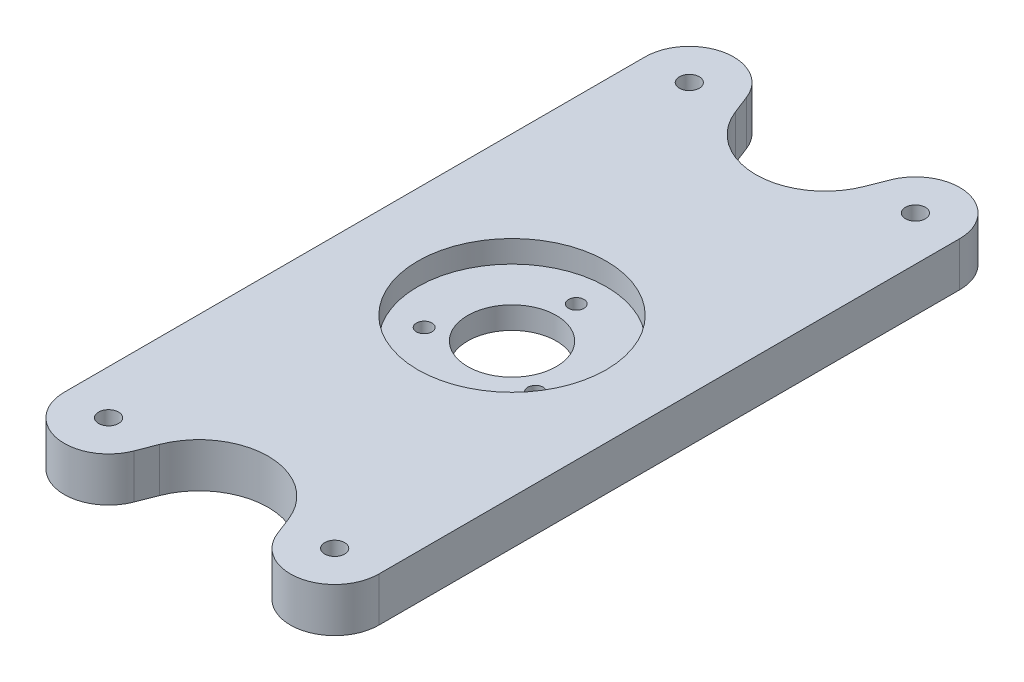
ISO-10303-21;
HEADER;
FILE_DESCRIPTION(('STEP AP214'),'2;1');
FILE_NAME('part.step','',(''),(''),'','','');
FILE_SCHEMA(('AUTOMOTIVE_DESIGN { 1 0 10303 214 1 1 1 1 }'));
ENDSEC;
DATA;
#1=APPLICATION_CONTEXT('core data for automotive mechanical design processes');
#2=APPLICATION_PROTOCOL_DEFINITION('international standard','automotive_design',2000,#1);
#3=PRODUCT_CONTEXT('',#1,'mechanical');
#4=PRODUCT('Part','Part','',(#3));
#5=PRODUCT_RELATED_PRODUCT_CATEGORY('part','',(#4));
#6=PRODUCT_DEFINITION_FORMATION('','',#4);
#7=PRODUCT_DEFINITION_CONTEXT('part definition',#1,'design');
#8=PRODUCT_DEFINITION('design','',#6,#7);
#9=PRODUCT_DEFINITION_SHAPE('','',#8);
#10=(LENGTH_UNIT() NAMED_UNIT(*) SI_UNIT(.MILLI.,.METRE.));
#11=(NAMED_UNIT(*) PLANE_ANGLE_UNIT() SI_UNIT($,.RADIAN.));
#12=(NAMED_UNIT(*) SI_UNIT($,.STERADIAN.) SOLID_ANGLE_UNIT());
#13=UNCERTAINTY_MEASURE_WITH_UNIT(LENGTH_MEASURE(1.E-05),#10,'distance_accuracy_value','');
#14=(GEOMETRIC_REPRESENTATION_CONTEXT(3) GLOBAL_UNCERTAINTY_ASSIGNED_CONTEXT((#13)) GLOBAL_UNIT_ASSIGNED_CONTEXT((#10,
#11,#12)) REPRESENTATION_CONTEXT('',''));
#15=CARTESIAN_POINT('',(0.,0.,0.));
#16=DIRECTION('',(0.,0.,1.));
#17=DIRECTION('',(1.,0.,0.));
#18=AXIS2_PLACEMENT_3D('',#15,#16,#17);
#19=CARTESIAN_POINT('',(9.3187111062915,10.,3.62789516351805));
#20=DIRECTION('',(0.931871110629158,0.,0.362789516351808));
#21=DIRECTION('',(0.362789516351808,0.,-0.931871110629158));
#22=AXIS2_PLACEMENT_3D('',#19,#20,#21);
#23=PLANE('',#22);
#24=DIRECTION('',(-0.362789516351808,0.,0.931871110629158));
#25=VECTOR('',#24,1.);
#26=CARTESIAN_POINT('',(9.3187111062915,0.,3.62789516351805));
#27=LINE('',#26,#25);
#28=CARTESIAN_POINT('',(-14.5561128633833,0.,64.9534233993496));
#29=VERTEX_POINT('',#28);
#30=CARTESIAN_POINT('',(-16.1812888937084,0.,69.1278951635181));
#31=VERTEX_POINT('',#30);
#32=EDGE_CURVE('E185',#29,#31,#27,.T.);
#33=ORIENTED_EDGE('',*,*,#32,.F.);
#34=DIRECTION('',(0.,-1.,0.));
#35=VECTOR('',#34,1.);
#36=CARTESIAN_POINT('',(-14.5561128633833,10.,64.9534233993496));
#37=LINE('',#36,#35);
#38=CARTESIAN_POINT('',(-14.5561128633833,10.,64.9534233993496));
#39=VERTEX_POINT('',#38);
#40=EDGE_CURVE('E11',#39,#29,#37,.T.);
#41=ORIENTED_EDGE('',*,*,#40,.F.);
#42=DIRECTION('',(-0.362789516351808,0.,0.931871110629158));
#43=VECTOR('',#42,1.);
#44=CARTESIAN_POINT('',(9.3187111062915,10.,3.62789516351805));
#45=LINE('',#44,#43);
#46=CARTESIAN_POINT('',(-16.1812888937084,10.,69.1278951635181));
#47=VERTEX_POINT('',#46);
#48=EDGE_CURVE('E358',#39,#47,#45,.T.);
#49=ORIENTED_EDGE('',*,*,#48,.T.);
#50=DIRECTION('',(0.,-1.,0.));
#51=VECTOR('',#50,1.);
#52=CARTESIAN_POINT('',(-16.1812888937084,10.,69.1278951635181));
#53=LINE('',#52,#51);
#54=EDGE_CURVE('E98',#47,#31,#53,.T.);
#55=ORIENTED_EDGE('',*,*,#54,.T.);
#56=EDGE_LOOP('',(#33,#41,#49,#55));
#57=FACE_BOUND('',#56,.T.);
#58=ADVANCED_FACE('F35',(#57),#23,.T.);
#59=CARTESIAN_POINT('',(0.,10.,70.6203070331858));
#60=DIRECTION('',(0.,-1.,0.));
#61=DIRECTION('',(0.,0.,-1.));
#62=AXIS2_PLACEMENT_3D('',#59,#60,#61);
#63=CYLINDRICAL_SURFACE('',#62,15.6203070331863);
#64=CARTESIAN_POINT('',(0.,0.,70.6203070331858));
#65=DIRECTION('',(0.,1.,0.));
#66=DIRECTION('',(0.,0.,1.));
#67=AXIS2_PLACEMENT_3D('',#64,#65,#66);
#68=CIRCLE('',#67,15.6203070331863);
#69=CARTESIAN_POINT('',(14.5561128633841,0.,64.9534233993491));
#70=VERTEX_POINT('',#69);
#71=EDGE_CURVE('E183',#29,#70,#68,.F.);
#72=ORIENTED_EDGE('',*,*,#71,.T.);
#73=DIRECTION('',(0.,-1.,0.));
#74=VECTOR('',#73,1.);
#75=CARTESIAN_POINT('',(14.5561128633841,10.,64.9534233993491));
#76=LINE('',#75,#74);
#77=CARTESIAN_POINT('',(14.5561128633841,10.,64.9534233993491));
#78=VERTEX_POINT('',#77);
#79=EDGE_CURVE('E44',#78,#70,#76,.T.);
#80=ORIENTED_EDGE('',*,*,#79,.F.);
#81=CARTESIAN_POINT('',(0.,10.,70.6203070331858));
#82=DIRECTION('',(0.,1.,0.));
#83=DIRECTION('',(0.,0.,1.));
#84=AXIS2_PLACEMENT_3D('',#81,#82,#83);
#85=CIRCLE('',#84,15.6203070331863);
#86=EDGE_CURVE('E360',#39,#78,#85,.F.);
#87=ORIENTED_EDGE('',*,*,#86,.F.);
#88=ORIENTED_EDGE('',*,*,#40,.T.);
#89=EDGE_LOOP('',(#72,#80,#87,#88));
#90=FACE_BOUND('',#89,.T.);
#91=ADVANCED_FACE('F184',(#90),#63,.F.);
#92=CARTESIAN_POINT('',(-9.31871110627818,10.,3.62789516351056));
#93=DIRECTION('',(0.931871110629236,0.,-0.362789516351608));
#94=DIRECTION('',(-0.362789516351608,0.,-0.931871110629236));
#95=AXIS2_PLACEMENT_3D('',#92,#93,#94);
#96=PLANE('',#95);
#97=DIRECTION('',(0.362789516351608,0.,0.931871110629236));
#98=VECTOR('',#97,1.);
#99=CARTESIAN_POINT('',(-9.31871110627818,0.,3.62789516351056));
#100=LINE('',#99,#98);
#101=CARTESIAN_POINT('',(16.1812888937084,0.,69.1278951635181));
#102=VERTEX_POINT('',#101);
#103=EDGE_CURVE('E177',#70,#102,#100,.T.);
#104=ORIENTED_EDGE('',*,*,#103,.T.);
#105=DIRECTION('',(0.,-1.,0.));
#106=VECTOR('',#105,1.);
#107=CARTESIAN_POINT('',(16.1812888937084,10.,69.1278951635181));
#108=LINE('',#107,#106);
#109=CARTESIAN_POINT('',(16.1812888937084,10.,69.1278951635181));
#110=VERTEX_POINT('',#109);
#111=EDGE_CURVE('E168',#110,#102,#108,.T.);
#112=ORIENTED_EDGE('',*,*,#111,.F.);
#113=DIRECTION('',(0.362789516351608,0.,0.931871110629236));
#114=VECTOR('',#113,1.);
#115=CARTESIAN_POINT('',(-9.31871110627818,10.,3.62789516351056));
#116=LINE('',#115,#114);
#117=EDGE_CURVE('E179',#78,#110,#116,.T.);
#118=ORIENTED_EDGE('',*,*,#117,.F.);
#119=ORIENTED_EDGE('',*,*,#79,.T.);
#120=EDGE_LOOP('',(#104,#112,#118,#119));
#121=FACE_BOUND('',#120,.T.);
#122=ADVANCED_FACE('F175',(#121),#96,.F.);
#123=CARTESIAN_POINT('',(25.5,10.,65.5));
#124=DIRECTION('',(0.,-1.,0.));
#125=DIRECTION('',(0.,0.,-1.));
#126=AXIS2_PLACEMENT_3D('',#123,#124,#125);
#127=CYLINDRICAL_SURFACE('',#126,9.99999999999997);
#128=CARTESIAN_POINT('',(25.5,0.,65.5));
#129=DIRECTION('',(0.,1.,0.));
#130=DIRECTION('',(0.,0.,1.));
#131=AXIS2_PLACEMENT_3D('',#128,#129,#130);
#132=CIRCLE('',#131,9.99999999999997);
#133=CARTESIAN_POINT('',(35.5,0.,65.5));
#134=VERTEX_POINT('',#133);
#135=EDGE_CURVE('E187',#102,#134,#132,.T.);
#136=ORIENTED_EDGE('',*,*,#135,.T.);
#137=DIRECTION('',(0.,-1.,0.));
#138=VECTOR('',#137,1.);
#139=CARTESIAN_POINT('',(35.5,10.,65.5));
#140=LINE('',#139,#138);
#141=CARTESIAN_POINT('',(35.5,10.,65.5));
#142=VERTEX_POINT('',#141);
#143=EDGE_CURVE('E166',#142,#134,#140,.T.);
#144=ORIENTED_EDGE('',*,*,#143,.F.);
#145=CARTESIAN_POINT('',(25.5,10.,65.5));
#146=DIRECTION('',(0.,1.,0.));
#147=DIRECTION('',(0.,0.,1.));
#148=AXIS2_PLACEMENT_3D('',#145,#146,#147);
#149=CIRCLE('',#148,9.99999999999997);
#150=EDGE_CURVE('E363',#110,#142,#149,.T.);
#151=ORIENTED_EDGE('',*,*,#150,.F.);
#152=ORIENTED_EDGE('',*,*,#111,.T.);
#153=EDGE_LOOP('',(#136,#144,#151,#152));
#154=FACE_BOUND('',#153,.T.);
#155=ADVANCED_FACE('F253',(#154),#127,.T.);
#156=CARTESIAN_POINT('',(35.4999999999997,10.,-1.72995629695884E-13));
#157=DIRECTION('',(1.,0.,0.));
#158=DIRECTION('',(0.,0.,-1.));
#159=AXIS2_PLACEMENT_3D('',#156,#157,#158);
#160=PLANE('',#159);
#161=DIRECTION('',(0.,0.,1.));
#162=VECTOR('',#161,1.);
#163=CARTESIAN_POINT('',(35.4999999999997,0.,-1.72995629695884E-13));
#164=LINE('',#163,#162);
#165=CARTESIAN_POINT('',(35.4999999999993,0.,-65.5));
#166=VERTEX_POINT('',#165);
#167=EDGE_CURVE('E195',#166,#134,#164,.T.);
#168=ORIENTED_EDGE('',*,*,#167,.F.);
#169=DIRECTION('',(0.,-1.,0.));
#170=VECTOR('',#169,1.);
#171=CARTESIAN_POINT('',(35.4999999999993,10.,-65.5));
#172=LINE('',#171,#170);
#173=CARTESIAN_POINT('',(35.4999999999993,10.,-65.5));
#174=VERTEX_POINT('',#173);
#175=EDGE_CURVE('E164',#174,#166,#172,.T.);
#176=ORIENTED_EDGE('',*,*,#175,.F.);
#177=DIRECTION('',(0.,0.,1.));
#178=VECTOR('',#177,1.);
#179=CARTESIAN_POINT('',(35.4999999999997,10.,-1.72995629695884E-13));
#180=LINE('',#179,#178);
#181=EDGE_CURVE('E365',#174,#142,#180,.T.);
#182=ORIENTED_EDGE('',*,*,#181,.T.);
#183=ORIENTED_EDGE('',*,*,#143,.T.);
#184=EDGE_LOOP('',(#168,#176,#182,#183));
#185=FACE_BOUND('',#184,.T.);
#186=ADVANCED_FACE('F256',(#185),#160,.T.);
#187=CARTESIAN_POINT('',(25.5,10.,-65.5));
#188=DIRECTION('',(0.,-1.,0.));
#189=DIRECTION('',(0.,0.,-1.));
#190=AXIS2_PLACEMENT_3D('',#187,#188,#189);
#191=CYLINDRICAL_SURFACE('',#190,9.99999999999966);
#192=CARTESIAN_POINT('',(25.5,0.,-65.5));
#193=DIRECTION('',(0.,1.,0.));
#194=DIRECTION('',(0.,0.,1.));
#195=AXIS2_PLACEMENT_3D('',#192,#193,#194);
#196=CIRCLE('',#195,9.99999999999966);
#197=CARTESIAN_POINT('',(16.1812888937084,0.,-69.1278951635181));
#198=VERTEX_POINT('',#197);
#199=EDGE_CURVE('E198',#166,#198,#196,.T.);
#200=ORIENTED_EDGE('',*,*,#199,.T.);
#201=DIRECTION('',(0.,-1.,0.));
#202=VECTOR('',#201,1.);
#203=CARTESIAN_POINT('',(16.1812888937084,10.,-69.1278951635181));
#204=LINE('',#203,#202);
#205=CARTESIAN_POINT('',(16.1812888937084,10.,-69.1278951635181));
#206=VERTEX_POINT('',#205);
#207=EDGE_CURVE('E161',#206,#198,#204,.T.);
#208=ORIENTED_EDGE('',*,*,#207,.F.);
#209=CARTESIAN_POINT('',(25.5,10.,-65.5));
#210=DIRECTION('',(0.,1.,0.));
#211=DIRECTION('',(0.,0.,1.));
#212=AXIS2_PLACEMENT_3D('',#209,#210,#211);
#213=CIRCLE('',#212,9.99999999999966);
#214=EDGE_CURVE('E368',#174,#206,#213,.T.);
#215=ORIENTED_EDGE('',*,*,#214,.F.);
#216=ORIENTED_EDGE('',*,*,#175,.T.);
#217=EDGE_LOOP('',(#200,#208,#215,#216));
#218=FACE_BOUND('',#217,.T.);
#219=ADVANCED_FACE('F260',(#218),#191,.T.);
#220=CARTESIAN_POINT('',(-9.31871110628636,10.,-3.62789516351516));
#221=DIRECTION('',(0.931871110629188,0.,0.362789516351731));
#222=DIRECTION('',(0.362789516351731,0.,-0.931871110629188));
#223=AXIS2_PLACEMENT_3D('',#220,#221,#222);
#224=PLANE('',#223);
#225=DIRECTION('',(-0.362789516351731,0.,0.931871110629188));
#226=VECTOR('',#225,1.);
#227=CARTESIAN_POINT('',(-9.31871110628636,0.,-3.62789516351516));
#228=LINE('',#227,#226);
#229=CARTESIAN_POINT('',(14.5561128633836,0.,-64.9534233993494));
#230=VERTEX_POINT('',#229);
#231=EDGE_CURVE('E201',#198,#230,#228,.T.);
#232=ORIENTED_EDGE('',*,*,#231,.T.);
#233=DIRECTION('',(0.,-1.,0.));
#234=VECTOR('',#233,1.);
#235=CARTESIAN_POINT('',(14.5561128633836,10.,-64.9534233993494));
#236=LINE('',#235,#234);
#237=CARTESIAN_POINT('',(14.5561128633836,10.,-64.9534233993494));
#238=VERTEX_POINT('',#237);
#239=EDGE_CURVE('E159',#238,#230,#236,.T.);
#240=ORIENTED_EDGE('',*,*,#239,.F.);
#241=DIRECTION('',(-0.362789516351731,0.,0.931871110629188));
#242=VECTOR('',#241,1.);
#243=CARTESIAN_POINT('',(-9.31871110628636,10.,-3.62789516351516));
#244=LINE('',#243,#242);
#245=EDGE_CURVE('E371',#206,#238,#244,.T.);
#246=ORIENTED_EDGE('',*,*,#245,.F.);
#247=ORIENTED_EDGE('',*,*,#207,.T.);
#248=EDGE_LOOP('',(#232,#240,#246,#247));
#249=FACE_BOUND('',#248,.T.);
#250=ADVANCED_FACE('F264',(#249),#224,.F.);
#251=CARTESIAN_POINT('',(0.,10.,-70.6203070331858));
#252=DIRECTION('',(0.,-1.,0.));
#253=DIRECTION('',(0.,0.,-1.));
#254=AXIS2_PLACEMENT_3D('',#251,#252,#253);
#255=CYLINDRICAL_SURFACE('',#254,15.620307033186);
#256=CARTESIAN_POINT('',(0.,0.,-70.6203070331858));
#257=DIRECTION('',(0.,1.,0.));
#258=DIRECTION('',(0.,0.,1.));
#259=AXIS2_PLACEMENT_3D('',#256,#257,#258);
#260=CIRCLE('',#259,15.620307033186);
#261=CARTESIAN_POINT('',(-14.5561128633833,0.,-64.9534233993495));
#262=VERTEX_POINT('',#261);
#263=EDGE_CURVE('E204',#262,#230,#260,.T.);
#264=ORIENTED_EDGE('',*,*,#263,.F.);
#265=DIRECTION('',(0.,-1.,0.));
#266=VECTOR('',#265,1.);
#267=CARTESIAN_POINT('',(-14.5561128633833,10.,-64.9534233993495));
#268=LINE('',#267,#266);
#269=CARTESIAN_POINT('',(-14.5561128633833,10.,-64.9534233993495));
#270=VERTEX_POINT('',#269);
#271=EDGE_CURVE('E153',#270,#262,#268,.T.);
#272=ORIENTED_EDGE('',*,*,#271,.F.);
#273=CARTESIAN_POINT('',(0.,10.,-70.6203070331858));
#274=DIRECTION('',(0.,1.,0.));
#275=DIRECTION('',(0.,0.,1.));
#276=AXIS2_PLACEMENT_3D('',#273,#274,#275);
#277=CIRCLE('',#276,15.620307033186);
#278=EDGE_CURVE('E373',#270,#238,#277,.T.);
#279=ORIENTED_EDGE('',*,*,#278,.T.);
#280=ORIENTED_EDGE('',*,*,#239,.T.);
#281=EDGE_LOOP('',(#264,#272,#279,#280));
#282=FACE_BOUND('',#281,.T.);
#283=ADVANCED_FACE('F268',(#282),#255,.F.);
#284=CARTESIAN_POINT('',(9.31871110629151,10.,-3.62789516351806));
#285=DIRECTION('',(0.931871110629158,0.,-0.362789516351809));
#286=DIRECTION('',(-0.362789516351809,0.,-0.931871110629158));
#287=AXIS2_PLACEMENT_3D('',#284,#285,#286);
#288=PLANE('',#287);
#289=DIRECTION('',(0.362789516351809,0.,0.931871110629158));
#290=VECTOR('',#289,1.);
#291=CARTESIAN_POINT('',(9.31871110629151,0.,-3.62789516351806));
#292=LINE('',#291,#290);
#293=CARTESIAN_POINT('',(-16.1812888937083,0.,-69.1278951635176));
#294=VERTEX_POINT('',#293);
#295=EDGE_CURVE('E207',#294,#262,#292,.T.);
#296=ORIENTED_EDGE('',*,*,#295,.F.);
#297=DIRECTION('',(0.,-1.,0.));
#298=VECTOR('',#297,1.);
#299=CARTESIAN_POINT('',(-16.1812888937083,10.,-69.1278951635176));
#300=LINE('',#299,#298);
#301=CARTESIAN_POINT('',(-16.1812888937083,10.,-69.1278951635176));
#302=VERTEX_POINT('',#301);
#303=EDGE_CURVE('E151',#302,#294,#300,.T.);
#304=ORIENTED_EDGE('',*,*,#303,.F.);
#305=DIRECTION('',(0.362789516351809,0.,0.931871110629158));
#306=VECTOR('',#305,1.);
#307=CARTESIAN_POINT('',(9.31871110629151,10.,-3.62789516351806));
#308=LINE('',#307,#306);
#309=EDGE_CURVE('E145',#302,#270,#308,.T.);
#310=ORIENTED_EDGE('',*,*,#309,.T.);
#311=ORIENTED_EDGE('',*,*,#271,.T.);
#312=EDGE_LOOP('',(#296,#304,#310,#311));
#313=FACE_BOUND('',#312,.T.);
#314=ADVANCED_FACE('F272',(#313),#288,.T.);
#315=CARTESIAN_POINT('',(-25.5,10.,-65.5));
#316=DIRECTION('',(0.,-1.,0.));
#317=DIRECTION('',(0.,0.,-1.));
#318=AXIS2_PLACEMENT_3D('',#315,#316,#317);
#319=CYLINDRICAL_SURFACE('',#318,9.99999999999965);
#320=CARTESIAN_POINT('',(-25.5,0.,-65.5));
#321=DIRECTION('',(0.,1.,0.));
#322=DIRECTION('',(0.,0.,1.));
#323=AXIS2_PLACEMENT_3D('',#320,#321,#322);
#324=CIRCLE('',#323,9.99999999999965);
#325=CARTESIAN_POINT('',(-35.4999999999993,0.,-65.5));
#326=VERTEX_POINT('',#325);
#327=EDGE_CURVE('E150',#294,#326,#324,.T.);
#328=ORIENTED_EDGE('',*,*,#327,.T.);
#329=DIRECTION('',(0.,-1.,0.));
#330=VECTOR('',#329,1.);
#331=CARTESIAN_POINT('',(-35.4999999999993,10.,-65.5));
#332=LINE('',#331,#330);
#333=CARTESIAN_POINT('',(-35.4999999999993,10.,-65.5));
#334=VERTEX_POINT('',#333);
#335=EDGE_CURVE('E135',#334,#326,#332,.T.);
#336=ORIENTED_EDGE('',*,*,#335,.F.);
#337=CARTESIAN_POINT('',(-25.5,10.,-65.5));
#338=DIRECTION('',(0.,1.,0.));
#339=DIRECTION('',(0.,0.,1.));
#340=AXIS2_PLACEMENT_3D('',#337,#338,#339);
#341=CIRCLE('',#340,9.99999999999965);
#342=EDGE_CURVE('E138',#302,#334,#341,.T.);
#343=ORIENTED_EDGE('',*,*,#342,.F.);
#344=ORIENTED_EDGE('',*,*,#303,.T.);
#345=EDGE_LOOP('',(#328,#336,#343,#344));
#346=FACE_BOUND('',#345,.T.);
#347=ADVANCED_FACE('F148',(#346),#319,.T.);
#348=CARTESIAN_POINT('',(-35.4999999999997,10.,-1.80517178813096E-13));
#349=DIRECTION('',(1.,0.,0.));
#350=DIRECTION('',(0.,0.,-1.));
#351=AXIS2_PLACEMENT_3D('',#348,#349,#350);
#352=PLANE('',#351);
#353=DIRECTION('',(0.,0.,1.));
#354=VECTOR('',#353,1.);
#355=CARTESIAN_POINT('',(-35.4999999999997,0.,-1.80517178813096E-13));
#356=LINE('',#355,#354);
#357=CARTESIAN_POINT('',(-35.5,0.,65.5));
#358=VERTEX_POINT('',#357);
#359=EDGE_CURVE('E211',#326,#358,#356,.T.);
#360=ORIENTED_EDGE('',*,*,#359,.T.);
#361=DIRECTION('',(0.,-1.,0.));
#362=VECTOR('',#361,1.);
#363=CARTESIAN_POINT('',(-35.5,10.,65.5));
#364=LINE('',#363,#362);
#365=CARTESIAN_POINT('',(-35.5,10.,65.5));
#366=VERTEX_POINT('',#365);
#367=EDGE_CURVE('E137',#366,#358,#364,.T.);
#368=ORIENTED_EDGE('',*,*,#367,.F.);
#369=DIRECTION('',(0.,0.,1.));
#370=VECTOR('',#369,1.);
#371=CARTESIAN_POINT('',(-35.4999999999997,10.,-1.80517178813096E-13));
#372=LINE('',#371,#370);
#373=EDGE_CURVE('E130',#334,#366,#372,.T.);
#374=ORIENTED_EDGE('',*,*,#373,.F.);
#375=ORIENTED_EDGE('',*,*,#335,.T.);
#376=EDGE_LOOP('',(#360,#368,#374,#375));
#377=FACE_BOUND('',#376,.T.);
#378=ADVANCED_FACE('F133',(#377),#352,.F.);
#379=CARTESIAN_POINT('',(25.5,10.,65.5));
#380=DIRECTION('',(0.,-1.,0.));
#381=DIRECTION('',(0.,0.,-1.));
#382=AXIS2_PLACEMENT_3D('',#379,#380,#381);
#383=CYLINDRICAL_SURFACE('',#382,2.25);
#384=CARTESIAN_POINT('',(25.5,10.,65.5));
#385=DIRECTION('',(0.,1.,0.));
#386=DIRECTION('',(0.,0.,1.));
#387=AXIS2_PLACEMENT_3D('',#384,#385,#386);
#388=CIRCLE('',#387,2.25);
#389=CARTESIAN_POINT('',(25.5,10.,67.75));
#390=VERTEX_POINT('',#389);
#391=EDGE_CURVE('E356',#390,#390,#388,.T.);
#392=ORIENTED_EDGE('',*,*,#391,.T.);
#393=EDGE_LOOP('',(#392));
#394=FACE_BOUND('',#393,.T.);
#395=CARTESIAN_POINT('',(25.5,0.,65.5));
#396=DIRECTION('',(0.,1.,0.));
#397=DIRECTION('',(0.,0.,1.));
#398=AXIS2_PLACEMENT_3D('',#395,#396,#397);
#399=CIRCLE('',#398,2.25);
#400=CARTESIAN_POINT('',(25.5,0.,67.75));
#401=VERTEX_POINT('',#400);
#402=EDGE_CURVE('E189',#401,#401,#399,.T.);
#403=ORIENTED_EDGE('',*,*,#402,.F.);
#404=EDGE_LOOP('',(#403));
#405=FACE_BOUND('',#404,.T.);
#406=ADVANCED_FACE('F230',(#394,#405),#383,.F.);
#407=CARTESIAN_POINT('',(-25.5,10.,65.5));
#408=DIRECTION('',(0.,-1.,0.));
#409=DIRECTION('',(0.,0.,-1.));
#410=AXIS2_PLACEMENT_3D('',#407,#408,#409);
#411=CYLINDRICAL_SURFACE('',#410,2.25);
#412=CARTESIAN_POINT('',(-25.5,10.,65.5));
#413=DIRECTION('',(0.,1.,0.));
#414=DIRECTION('',(0.,0.,1.));
#415=AXIS2_PLACEMENT_3D('',#412,#413,#414);
#416=CIRCLE('',#415,2.25);
#417=CARTESIAN_POINT('',(-25.5,10.,67.75));
#418=VERTEX_POINT('',#417);
#419=EDGE_CURVE('E353',#418,#418,#416,.T.);
#420=ORIENTED_EDGE('',*,*,#419,.T.);
#421=EDGE_LOOP('',(#420));
#422=FACE_BOUND('',#421,.T.);
#423=CARTESIAN_POINT('',(-25.5,0.,65.5));
#424=DIRECTION('',(0.,1.,0.));
#425=DIRECTION('',(0.,0.,1.));
#426=AXIS2_PLACEMENT_3D('',#423,#424,#425);
#427=CIRCLE('',#426,2.25);
#428=CARTESIAN_POINT('',(-25.5,0.,67.75));
#429=VERTEX_POINT('',#428);
#430=EDGE_CURVE('E223',#429,#429,#427,.T.);
#431=ORIENTED_EDGE('',*,*,#430,.F.);
#432=EDGE_LOOP('',(#431));
#433=FACE_BOUND('',#432,.T.);
#434=ADVANCED_FACE('F232',(#422,#433),#411,.F.);
#435=CARTESIAN_POINT('',(-25.5,10.,-65.5));
#436=DIRECTION('',(0.,-1.,0.));
#437=DIRECTION('',(0.,0.,-1.));
#438=AXIS2_PLACEMENT_3D('',#435,#436,#437);
#439=CYLINDRICAL_SURFACE('',#438,2.25);
#440=CARTESIAN_POINT('',(-25.5,10.,-65.5));
#441=DIRECTION('',(0.,1.,0.));
#442=DIRECTION('',(0.,0.,1.));
#443=AXIS2_PLACEMENT_3D('',#440,#441,#442);
#444=CIRCLE('',#443,2.25);
#445=CARTESIAN_POINT('',(-25.5,10.,-63.25));
#446=VERTEX_POINT('',#445);
#447=EDGE_CURVE('E350',#446,#446,#444,.T.);
#448=ORIENTED_EDGE('',*,*,#447,.T.);
#449=EDGE_LOOP('',(#448));
#450=FACE_BOUND('',#449,.T.);
#451=CARTESIAN_POINT('',(-25.5,0.,-65.5));
#452=DIRECTION('',(0.,1.,0.));
#453=DIRECTION('',(0.,0.,1.));
#454=AXIS2_PLACEMENT_3D('',#451,#452,#453);
#455=CIRCLE('',#454,2.25);
#456=CARTESIAN_POINT('',(-25.5,0.,-63.25));
#457=VERTEX_POINT('',#456);
#458=EDGE_CURVE('E219',#457,#457,#455,.T.);
#459=ORIENTED_EDGE('',*,*,#458,.F.);
#460=EDGE_LOOP('',(#459));
#461=FACE_BOUND('',#460,.T.);
#462=ADVANCED_FACE('F239',(#450,#461),#439,.F.);
#463=CARTESIAN_POINT('',(25.5,10.,-65.5));
#464=DIRECTION('',(0.,-1.,0.));
#465=DIRECTION('',(0.,0.,-1.));
#466=AXIS2_PLACEMENT_3D('',#463,#464,#465);
#467=CYLINDRICAL_SURFACE('',#466,2.25);
#468=CARTESIAN_POINT('',(25.5,10.,-65.5));
#469=DIRECTION('',(0.,1.,0.));
#470=DIRECTION('',(0.,0.,1.));
#471=AXIS2_PLACEMENT_3D('',#468,#469,#470);
#472=CIRCLE('',#471,2.25);
#473=CARTESIAN_POINT('',(25.5,10.,-63.25));
#474=VERTEX_POINT('',#473);
#475=EDGE_CURVE('E213',#474,#474,#472,.T.);
#476=ORIENTED_EDGE('',*,*,#475,.T.);
#477=EDGE_LOOP('',(#476));
#478=FACE_BOUND('',#477,.T.);
#479=CARTESIAN_POINT('',(25.5,0.,-65.5));
#480=DIRECTION('',(0.,1.,0.));
#481=DIRECTION('',(0.,0.,1.));
#482=AXIS2_PLACEMENT_3D('',#479,#480,#481);
#483=CIRCLE('',#482,2.25);
#484=CARTESIAN_POINT('',(25.5,0.,-63.25));
#485=VERTEX_POINT('',#484);
#486=EDGE_CURVE('E216',#485,#485,#483,.T.);
#487=ORIENTED_EDGE('',*,*,#486,.F.);
#488=EDGE_LOOP('',(#487));
#489=FACE_BOUND('',#488,.T.);
#490=ADVANCED_FACE('F37',(#478,#489),#467,.F.);
#491=CARTESIAN_POINT('',(-25.5,10.,65.5));
#492=DIRECTION('',(0.,-1.,0.));
#493=DIRECTION('',(0.,0.,-1.));
#494=AXIS2_PLACEMENT_3D('',#491,#492,#493);
#495=CYLINDRICAL_SURFACE('',#494,10.);
#496=CARTESIAN_POINT('',(-25.5,0.,65.5));
#497=DIRECTION('',(0.,1.,0.));
#498=DIRECTION('',(0.,0.,1.));
#499=AXIS2_PLACEMENT_3D('',#496,#497,#498);
#500=CIRCLE('',#499,10.);
#501=EDGE_CURVE('E91',#358,#31,#500,.T.);
#502=ORIENTED_EDGE('',*,*,#501,.T.);
#503=ORIENTED_EDGE('',*,*,#54,.F.);
#504=CARTESIAN_POINT('',(-25.5,10.,65.5));
#505=DIRECTION('',(0.,1.,0.));
#506=DIRECTION('',(0.,0.,1.));
#507=AXIS2_PLACEMENT_3D('',#504,#505,#506);
#508=CIRCLE('',#507,10.);
#509=EDGE_CURVE('E52',#366,#47,#508,.T.);
#510=ORIENTED_EDGE('',*,*,#509,.F.);
#511=ORIENTED_EDGE('',*,*,#367,.T.);
#512=EDGE_LOOP('',(#502,#503,#510,#511));
#513=FACE_BOUND('',#512,.T.);
#514=ADVANCED_FACE('F279',(#513),#495,.T.);
#515=CARTESIAN_POINT('',(0.,10.,0.));
#516=DIRECTION('',(0.,1.,0.));
#517=DIRECTION('',(0.,0.,1.));
#518=AXIS2_PLACEMENT_3D('',#515,#516,#517);
#519=PLANE('',#518);
#520=CARTESIAN_POINT('',(0.,10.,0.));
#521=DIRECTION('',(0.,1.,0.));
#522=DIRECTION('',(0.,0.,1.));
#523=AXIS2_PLACEMENT_3D('',#520,#521,#522);
#524=CIRCLE('',#523,21.25);
#525=CARTESIAN_POINT('',(0.,10.,21.25));
#526=VERTEX_POINT('',#525);
#527=EDGE_CURVE('E324',#526,#526,#524,.T.);
#528=ORIENTED_EDGE('',*,*,#527,.F.);
#529=EDGE_LOOP('',(#528));
#530=FACE_BOUND('',#529,.T.);
#531=ORIENTED_EDGE('',*,*,#475,.F.);
#532=EDGE_LOOP('',(#531));
#533=FACE_BOUND('',#532,.T.);
#534=ORIENTED_EDGE('',*,*,#447,.F.);
#535=EDGE_LOOP('',(#534));
#536=FACE_BOUND('',#535,.T.);
#537=ORIENTED_EDGE('',*,*,#419,.F.);
#538=EDGE_LOOP('',(#537));
#539=FACE_BOUND('',#538,.T.);
#540=ORIENTED_EDGE('',*,*,#391,.F.);
#541=EDGE_LOOP('',(#540));
#542=FACE_BOUND('',#541,.T.);
#543=ORIENTED_EDGE('',*,*,#48,.F.);
#544=ORIENTED_EDGE('',*,*,#86,.T.);
#545=ORIENTED_EDGE('',*,*,#117,.T.);
#546=ORIENTED_EDGE('',*,*,#150,.T.);
#547=ORIENTED_EDGE('',*,*,#181,.F.);
#548=ORIENTED_EDGE('',*,*,#214,.T.);
#549=ORIENTED_EDGE('',*,*,#245,.T.);
#550=ORIENTED_EDGE('',*,*,#278,.F.);
#551=ORIENTED_EDGE('',*,*,#309,.F.);
#552=ORIENTED_EDGE('',*,*,#342,.T.);
#553=ORIENTED_EDGE('',*,*,#373,.T.);
#554=ORIENTED_EDGE('',*,*,#509,.T.);
#555=EDGE_LOOP('',(#543,#544,#545,#546,#547,#548,#549,#550,#551,#552,#553,#554));
#556=FACE_BOUND('',#555,.T.);
#557=ADVANCED_FACE('F142',(#530,#533,#536,#539,#542,#556),#519,.T.);
#558=CARTESIAN_POINT('',(0.,0.,0.));
#559=DIRECTION('',(0.,1.,0.));
#560=DIRECTION('',(0.,0.,1.));
#561=AXIS2_PLACEMENT_3D('',#558,#559,#560);
#562=PLANE('',#561);
#563=CARTESIAN_POINT('',(0.,0.,-14.5));
#564=DIRECTION('',(0.,1.,0.));
#565=DIRECTION('',(0.,0.,1.));
#566=AXIS2_PLACEMENT_3D('',#563,#564,#565);
#567=CIRCLE('',#566,1.75);
#568=CARTESIAN_POINT('',(0.,0.,-12.75));
#569=VERTEX_POINT('',#568);
#570=EDGE_CURVE('E317',#569,#569,#567,.T.);
#571=ORIENTED_EDGE('',*,*,#570,.T.);
#572=EDGE_LOOP('',(#571));
#573=FACE_BOUND('',#572,.T.);
#574=CARTESIAN_POINT('',(0.,0.,0.));
#575=DIRECTION('',(0.,1.,0.));
#576=DIRECTION('',(0.,0.,1.));
#577=AXIS2_PLACEMENT_3D('',#574,#575,#576);
#578=CIRCLE('',#577,10.);
#579=CARTESIAN_POINT('',(0.,0.,10.));
#580=VERTEX_POINT('',#579);
#581=EDGE_CURVE('E322',#580,#580,#578,.T.);
#582=ORIENTED_EDGE('',*,*,#581,.T.);
#583=EDGE_LOOP('',(#582));
#584=FACE_BOUND('',#583,.T.);
#585=CARTESIAN_POINT('',(12.5573683548753,0.,7.24999999999947));
#586=DIRECTION('',(0.,1.,0.));
#587=DIRECTION('',(0.,0.,1.));
#588=AXIS2_PLACEMENT_3D('',#585,#586,#587);
#589=CIRCLE('',#588,1.7500000000008);
#590=CARTESIAN_POINT('',(12.5573683548753,0.,9.00000000000026));
#591=VERTEX_POINT('',#590);
#592=EDGE_CURVE('E332',#591,#591,#589,.T.);
#593=ORIENTED_EDGE('',*,*,#592,.T.);
#594=EDGE_LOOP('',(#593));
#595=FACE_BOUND('',#594,.T.);
#596=CARTESIAN_POINT('',(-12.5573683548734,0.,7.25000000000054));
#597=DIRECTION('',(0.,1.,0.));
#598=DIRECTION('',(0.,0.,1.));
#599=AXIS2_PLACEMENT_3D('',#596,#597,#598);
#600=CIRCLE('',#599,1.75000000000117);
#601=CARTESIAN_POINT('',(-12.5573683548734,0.,9.00000000000171));
#602=VERTEX_POINT('',#601);
#603=EDGE_CURVE('E338',#602,#602,#600,.T.);
#604=ORIENTED_EDGE('',*,*,#603,.T.);
#605=EDGE_LOOP('',(#604));
#606=FACE_BOUND('',#605,.T.);
#607=ORIENTED_EDGE('',*,*,#486,.T.);
#608=EDGE_LOOP('',(#607));
#609=FACE_BOUND('',#608,.T.);
#610=ORIENTED_EDGE('',*,*,#458,.T.);
#611=EDGE_LOOP('',(#610));
#612=FACE_BOUND('',#611,.T.);
#613=ORIENTED_EDGE('',*,*,#430,.T.);
#614=EDGE_LOOP('',(#613));
#615=FACE_BOUND('',#614,.T.);
#616=ORIENTED_EDGE('',*,*,#402,.T.);
#617=EDGE_LOOP('',(#616));
#618=FACE_BOUND('',#617,.T.);
#619=ORIENTED_EDGE('',*,*,#32,.T.);
#620=ORIENTED_EDGE('',*,*,#501,.F.);
#621=ORIENTED_EDGE('',*,*,#359,.F.);
#622=ORIENTED_EDGE('',*,*,#327,.F.);
#623=ORIENTED_EDGE('',*,*,#295,.T.);
#624=ORIENTED_EDGE('',*,*,#263,.T.);
#625=ORIENTED_EDGE('',*,*,#231,.F.);
#626=ORIENTED_EDGE('',*,*,#199,.F.);
#627=ORIENTED_EDGE('',*,*,#167,.T.);
#628=ORIENTED_EDGE('',*,*,#135,.F.);
#629=ORIENTED_EDGE('',*,*,#103,.F.);
#630=ORIENTED_EDGE('',*,*,#71,.F.);
#631=EDGE_LOOP('',(#619,#620,#621,#622,#623,#624,#625,#626,#627,#628,#629,#630));
#632=FACE_BOUND('',#631,.T.);
#633=ADVANCED_FACE('F228',(#573,#584,#595,#606,#609,#612,#615,#618,#632),#562,.F.);
#634=CARTESIAN_POINT('',(0.,5.,0.));
#635=DIRECTION('',(0.,1.,0.));
#636=DIRECTION('',(0.,0.,1.));
#637=AXIS2_PLACEMENT_3D('',#634,#635,#636);
#638=CYLINDRICAL_SURFACE('',#637,21.25);
#639=CARTESIAN_POINT('',(0.,5.,0.));
#640=DIRECTION('',(0.,1.,0.));
#641=DIRECTION('',(0.,0.,1.));
#642=AXIS2_PLACEMENT_3D('',#639,#640,#641);
#643=CIRCLE('',#642,21.25);
#644=CARTESIAN_POINT('',(0.,5.,21.25));
#645=VERTEX_POINT('',#644);
#646=EDGE_CURVE('E220',#645,#645,#643,.T.);
#647=ORIENTED_EDGE('',*,*,#646,.F.);
#648=EDGE_LOOP('',(#647));
#649=FACE_BOUND('',#648,.T.);
#650=ORIENTED_EDGE('',*,*,#527,.T.);
#651=EDGE_LOOP('',(#650));
#652=FACE_BOUND('',#651,.T.);
#653=ADVANCED_FACE('F285',(#649,#652),#638,.F.);
#654=CARTESIAN_POINT('',(0.,5.,0.));
#655=DIRECTION('',(0.,1.,0.));
#656=DIRECTION('',(0.,0.,1.));
#657=AXIS2_PLACEMENT_3D('',#654,#655,#656);
#658=PLANE('',#657);
#659=CARTESIAN_POINT('',(0.,5.,0.));
#660=DIRECTION('',(0.,1.,0.));
#661=DIRECTION('',(0.,0.,1.));
#662=AXIS2_PLACEMENT_3D('',#659,#660,#661);
#663=CIRCLE('',#662,10.);
#664=CARTESIAN_POINT('',(0.,5.,10.));
#665=VERTEX_POINT('',#664);
#666=EDGE_CURVE('E327',#665,#665,#663,.T.);
#667=ORIENTED_EDGE('',*,*,#666,.F.);
#668=EDGE_LOOP('',(#667));
#669=FACE_BOUND('',#668,.T.);
#670=CARTESIAN_POINT('',(0.,5.,-14.5));
#671=DIRECTION('',(0.,1.,0.));
#672=DIRECTION('',(0.,0.,1.));
#673=AXIS2_PLACEMENT_3D('',#670,#671,#672);
#674=CIRCLE('',#673,1.75);
#675=CARTESIAN_POINT('',(0.,5.,-12.75));
#676=VERTEX_POINT('',#675);
#677=EDGE_CURVE('E320',#676,#676,#674,.T.);
#678=ORIENTED_EDGE('',*,*,#677,.F.);
#679=EDGE_LOOP('',(#678));
#680=FACE_BOUND('',#679,.T.);
#681=CARTESIAN_POINT('',(12.5573683548753,5.,7.24999999999947));
#682=DIRECTION('',(0.,1.,0.));
#683=DIRECTION('',(0.,0.,1.));
#684=AXIS2_PLACEMENT_3D('',#681,#682,#683);
#685=CIRCLE('',#684,1.7500000000008);
#686=CARTESIAN_POINT('',(12.5573683548753,5.,9.00000000000026));
#687=VERTEX_POINT('',#686);
#688=EDGE_CURVE('E335',#687,#687,#685,.T.);
#689=ORIENTED_EDGE('',*,*,#688,.F.);
#690=EDGE_LOOP('',(#689));
#691=FACE_BOUND('',#690,.T.);
#692=CARTESIAN_POINT('',(-12.5573683548734,5.,7.25000000000054));
#693=DIRECTION('',(0.,1.,0.));
#694=DIRECTION('',(0.,0.,1.));
#695=AXIS2_PLACEMENT_3D('',#692,#693,#694);
#696=CIRCLE('',#695,1.75000000000117);
#697=CARTESIAN_POINT('',(-12.5573683548734,5.,9.00000000000171));
#698=VERTEX_POINT('',#697);
#699=EDGE_CURVE('E341',#698,#698,#696,.T.);
#700=ORIENTED_EDGE('',*,*,#699,.F.);
#701=EDGE_LOOP('',(#700));
#702=FACE_BOUND('',#701,.T.);
#703=ORIENTED_EDGE('',*,*,#646,.T.);
#704=EDGE_LOOP('',(#703));
#705=FACE_BOUND('',#704,.T.);
#706=ADVANCED_FACE('F292',(#669,#680,#691,#702,#705),#658,.T.);
#707=CARTESIAN_POINT('',(-12.5573683548734,0.,7.25000000000054));
#708=DIRECTION('',(0.,1.,0.));
#709=DIRECTION('',(0.,0.,1.));
#710=AXIS2_PLACEMENT_3D('',#707,#708,#709);
#711=CYLINDRICAL_SURFACE('',#710,1.75000000000117);
#712=ORIENTED_EDGE('',*,*,#603,.F.);
#713=EDGE_LOOP('',(#712));
#714=FACE_BOUND('',#713,.T.);
#715=ORIENTED_EDGE('',*,*,#699,.T.);
#716=EDGE_LOOP('',(#715));
#717=FACE_BOUND('',#716,.T.);
#718=ADVANCED_FACE('F296',(#714,#717),#711,.F.);
#719=CARTESIAN_POINT('',(12.5573683548753,0.,7.24999999999947));
#720=DIRECTION('',(0.,1.,0.));
#721=DIRECTION('',(0.,0.,1.));
#722=AXIS2_PLACEMENT_3D('',#719,#720,#721);
#723=CYLINDRICAL_SURFACE('',#722,1.7500000000008);
#724=ORIENTED_EDGE('',*,*,#592,.F.);
#725=EDGE_LOOP('',(#724));
#726=FACE_BOUND('',#725,.T.);
#727=ORIENTED_EDGE('',*,*,#688,.T.);
#728=EDGE_LOOP('',(#727));
#729=FACE_BOUND('',#728,.T.);
#730=ADVANCED_FACE('F300',(#726,#729),#723,.F.);
#731=CARTESIAN_POINT('',(0.,0.,-14.5));
#732=DIRECTION('',(0.,1.,0.));
#733=DIRECTION('',(0.,0.,1.));
#734=AXIS2_PLACEMENT_3D('',#731,#732,#733);
#735=CYLINDRICAL_SURFACE('',#734,1.75);
#736=ORIENTED_EDGE('',*,*,#570,.F.);
#737=EDGE_LOOP('',(#736));
#738=FACE_BOUND('',#737,.T.);
#739=ORIENTED_EDGE('',*,*,#677,.T.);
#740=EDGE_LOOP('',(#739));
#741=FACE_BOUND('',#740,.T.);
#742=ADVANCED_FACE('F304',(#738,#741),#735,.F.);
#743=CARTESIAN_POINT('',(0.,0.,0.));
#744=DIRECTION('',(0.,1.,0.));
#745=DIRECTION('',(0.,0.,1.));
#746=AXIS2_PLACEMENT_3D('',#743,#744,#745);
#747=CYLINDRICAL_SURFACE('',#746,10.);
#748=ORIENTED_EDGE('',*,*,#581,.F.);
#749=EDGE_LOOP('',(#748));
#750=FACE_BOUND('',#749,.T.);
#751=ORIENTED_EDGE('',*,*,#666,.T.);
#752=EDGE_LOOP('',(#751));
#753=FACE_BOUND('',#752,.T.);
#754=ADVANCED_FACE('F306',(#750,#753),#747,.F.);
#755=CLOSED_SHELL('',(#58,#91,#122,#155,#186,#219,#250,#283,#314,#347,#378,#406,#434,#462,#490,
#514,#557,#633,#653,#706,#718,#730,#742,#754));
#756=MANIFOLD_SOLID_BREP('B2',#755);
#757=ADVANCED_BREP_SHAPE_REPRESENTATION('',(#18,#756),#14);
#758=SHAPE_DEFINITION_REPRESENTATION(#9,#757);
ENDSEC;
END-ISO-10303-21;
